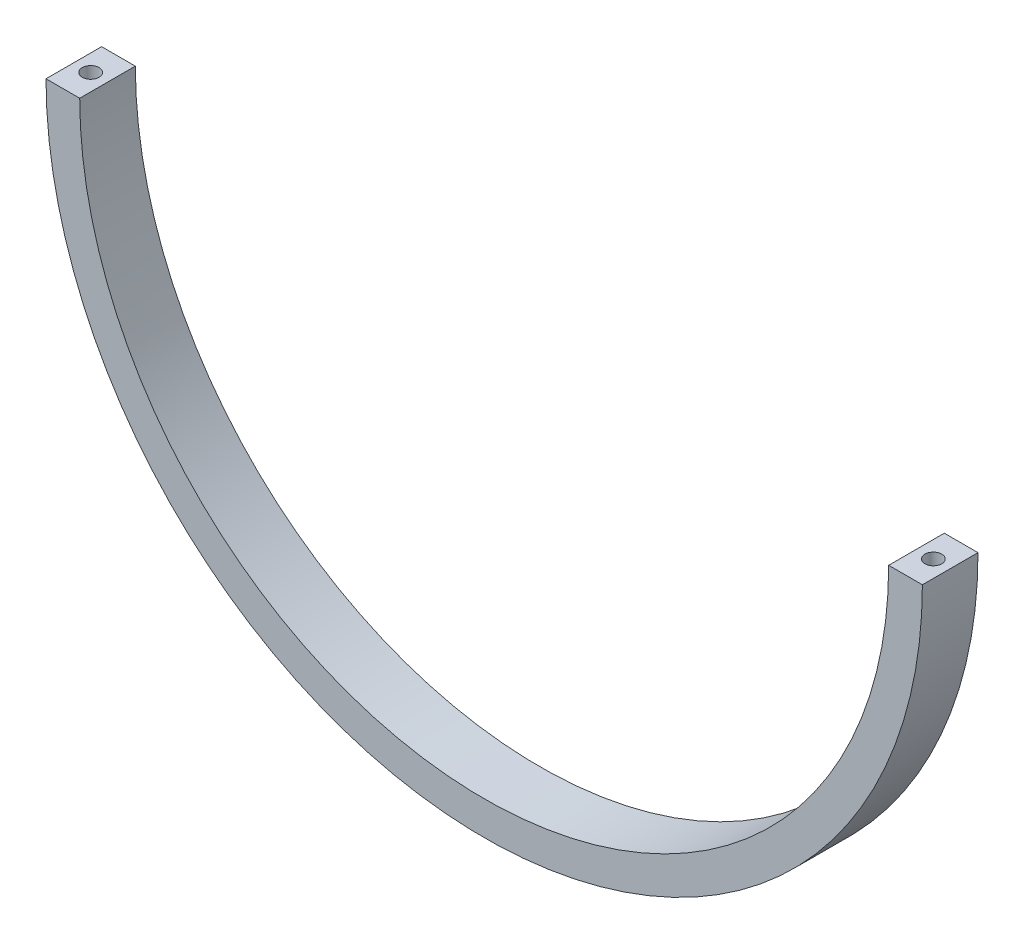
ISO-10303-21;
HEADER;
FILE_DESCRIPTION(('STEP AP214'),'2;1');
FILE_NAME('part.step','',(''),(''),'','','');
FILE_SCHEMA(('AUTOMOTIVE_DESIGN { 1 0 10303 214 1 1 1 1 }'));
ENDSEC;
DATA;
#1=APPLICATION_CONTEXT('core data for automotive mechanical design processes');
#2=APPLICATION_PROTOCOL_DEFINITION('international standard','automotive_design',2000,#1);
#3=PRODUCT_CONTEXT('',#1,'mechanical');
#4=PRODUCT('Part','Part','',(#3));
#5=PRODUCT_RELATED_PRODUCT_CATEGORY('part','',(#4));
#6=PRODUCT_DEFINITION_FORMATION('','',#4);
#7=PRODUCT_DEFINITION_CONTEXT('part definition',#1,'design');
#8=PRODUCT_DEFINITION('design','',#6,#7);
#9=PRODUCT_DEFINITION_SHAPE('','',#8);
#10=(LENGTH_UNIT() NAMED_UNIT(*) SI_UNIT(.MILLI.,.METRE.));
#11=(NAMED_UNIT(*) PLANE_ANGLE_UNIT() SI_UNIT($,.RADIAN.));
#12=(NAMED_UNIT(*) SI_UNIT($,.STERADIAN.) SOLID_ANGLE_UNIT());
#13=UNCERTAINTY_MEASURE_WITH_UNIT(LENGTH_MEASURE(1.E-05),#10,'distance_accuracy_value','');
#14=(GEOMETRIC_REPRESENTATION_CONTEXT(3) GLOBAL_UNCERTAINTY_ASSIGNED_CONTEXT((#13)) GLOBAL_UNIT_ASSIGNED_CONTEXT((#10,
#11,#12)) REPRESENTATION_CONTEXT('',''));
#15=CARTESIAN_POINT('',(0.,0.,0.));
#16=DIRECTION('',(0.,0.,1.));
#17=DIRECTION('',(1.,0.,0.));
#18=AXIS2_PLACEMENT_3D('',#15,#16,#17);
#19=CARTESIAN_POINT('',(0.,30.5190677017048,6.4339275));
#20=DIRECTION('',(0.,0.,-1.));
#21=DIRECTION('',(-1.,0.,0.));
#22=AXIS2_PLACEMENT_3D('',#19,#20,#21);
#23=CYLINDRICAL_SURFACE('',#22,69.5844);
#24=CARTESIAN_POINT('',(0.,30.5190677017048,-3.1339275));
#25=DIRECTION('',(0.,0.,-1.));
#26=DIRECTION('',(1.,0.,0.));
#27=AXIS2_PLACEMENT_3D('',#24,#25,#26);
#28=CIRCLE('',#27,69.5844);
#29=CARTESIAN_POINT('',(69.5844000000001,30.5190677017048,-3.1339275));
#30=VERTEX_POINT('',#29);
#31=CARTESIAN_POINT('',(-69.5844,30.5190677017048,-3.1339275));
#32=VERTEX_POINT('',#31);
#33=EDGE_CURVE('E97',#30,#32,#28,.T.);
#34=ORIENTED_EDGE('',*,*,#33,.T.);
#35=DIRECTION('',(0.,0.,-1.));
#36=VECTOR('',#35,1.);
#37=CARTESIAN_POINT('',(-69.5844,30.5190677017048,6.4339275));
#38=LINE('',#37,#36);
#39=CARTESIAN_POINT('',(-69.5844,30.5190677017048,6.4339275));
#40=VERTEX_POINT('',#39);
#41=EDGE_CURVE('E11',#40,#32,#38,.T.);
#42=ORIENTED_EDGE('',*,*,#41,.F.);
#43=CARTESIAN_POINT('',(0.,30.5190677017048,6.4339275));
#44=DIRECTION('',(0.,0.,-1.));
#45=DIRECTION('',(1.,0.,0.));
#46=AXIS2_PLACEMENT_3D('',#43,#44,#45);
#47=CIRCLE('',#46,69.5844);
#48=CARTESIAN_POINT('',(69.5844000000001,30.5190677017048,6.4339275));
#49=VERTEX_POINT('',#48);
#50=EDGE_CURVE('E85',#49,#40,#47,.T.);
#51=ORIENTED_EDGE('',*,*,#50,.F.);
#52=DIRECTION('',(0.,0.,-1.));
#53=VECTOR('',#52,1.);
#54=CARTESIAN_POINT('',(69.5844000000001,30.5190677017048,6.4339275));
#55=LINE('',#54,#53);
#56=EDGE_CURVE('E93',#49,#30,#55,.T.);
#57=ORIENTED_EDGE('',*,*,#56,.T.);
#58=EDGE_LOOP('',(#34,#42,#51,#57));
#59=FACE_BOUND('',#58,.T.);
#60=ADVANCED_FACE('F34',(#59),#23,.F.);
#61=CARTESIAN_POINT('',(-75.3831,30.5190677017048,6.4339275));
#62=DIRECTION('',(0.,-1.,0.));
#63=DIRECTION('',(0.,0.,-1.));
#64=AXIS2_PLACEMENT_3D('',#61,#62,#63);
#65=PLANE('',#64);
#66=CARTESIAN_POINT('',(-72.48375,30.5190677017048,1.65));
#67=DIRECTION('',(0.,1.,0.));
#68=DIRECTION('',(0.,0.,1.));
#69=AXIS2_PLACEMENT_3D('',#66,#67,#68);
#70=CIRCLE('',#69,1.449675);
#71=CARTESIAN_POINT('',(-72.48375,30.5190677017048,3.099675));
#72=VERTEX_POINT('',#71);
#73=EDGE_CURVE('E111',#72,#72,#70,.T.);
#74=ORIENTED_EDGE('',*,*,#73,.F.);
#75=EDGE_LOOP('',(#74));
#76=FACE_BOUND('',#75,.T.);
#77=DIRECTION('',(-1.,0.,0.));
#78=VECTOR('',#77,1.);
#79=CARTESIAN_POINT('',(-75.3831,30.5190677017048,-3.1339275));
#80=LINE('',#79,#78);
#81=CARTESIAN_POINT('',(-75.3831,30.5190677017048,-3.1339275));
#82=VERTEX_POINT('',#81);
#83=EDGE_CURVE('E89',#32,#82,#80,.T.);
#84=ORIENTED_EDGE('',*,*,#83,.T.);
#85=DIRECTION('',(0.,0.,-1.));
#86=VECTOR('',#85,1.);
#87=CARTESIAN_POINT('',(-75.3831,30.5190677017048,6.4339275));
#88=LINE('',#87,#86);
#89=CARTESIAN_POINT('',(-75.3831,30.5190677017048,6.4339275));
#90=VERTEX_POINT('',#89);
#91=EDGE_CURVE('E42',#90,#82,#88,.T.);
#92=ORIENTED_EDGE('',*,*,#91,.F.);
#93=DIRECTION('',(-1.,0.,0.));
#94=VECTOR('',#93,1.);
#95=CARTESIAN_POINT('',(-75.3831,30.5190677017048,6.4339275));
#96=LINE('',#95,#94);
#97=EDGE_CURVE('E80',#40,#90,#96,.T.);
#98=ORIENTED_EDGE('',*,*,#97,.F.);
#99=ORIENTED_EDGE('',*,*,#41,.T.);
#100=EDGE_LOOP('',(#84,#92,#98,#99));
#101=FACE_BOUND('',#100,.T.);
#102=ADVANCED_FACE('F88',(#76,#101),#65,.F.);
#103=CARTESIAN_POINT('',(0.,30.5190677017048,6.4339275));
#104=DIRECTION('',(0.,0.,-1.));
#105=DIRECTION('',(-1.,0.,0.));
#106=AXIS2_PLACEMENT_3D('',#103,#104,#105);
#107=CYLINDRICAL_SURFACE('',#106,75.3831);
#108=CARTESIAN_POINT('',(0.,30.5190677017048,-3.1339275));
#109=DIRECTION('',(0.,0.,1.));
#110=DIRECTION('',(1.,0.,0.));
#111=AXIS2_PLACEMENT_3D('',#108,#109,#110);
#112=CIRCLE('',#111,75.3831);
#113=CARTESIAN_POINT('',(75.3831000000001,30.5190677017048,-3.1339275));
#114=VERTEX_POINT('',#113);
#115=EDGE_CURVE('E67',#82,#114,#112,.T.);
#116=ORIENTED_EDGE('',*,*,#115,.T.);
#117=DIRECTION('',(0.,0.,-1.));
#118=VECTOR('',#117,1.);
#119=CARTESIAN_POINT('',(75.3831000000001,30.5190677017048,6.4339275));
#120=LINE('',#119,#118);
#121=CARTESIAN_POINT('',(75.3831000000001,30.5190677017048,6.4339275));
#122=VERTEX_POINT('',#121);
#123=EDGE_CURVE('E90',#122,#114,#120,.T.);
#124=ORIENTED_EDGE('',*,*,#123,.F.);
#125=CARTESIAN_POINT('',(0.,30.5190677017048,6.4339275));
#126=DIRECTION('',(0.,0.,1.));
#127=DIRECTION('',(1.,0.,0.));
#128=AXIS2_PLACEMENT_3D('',#125,#126,#127);
#129=CIRCLE('',#128,75.3831);
#130=EDGE_CURVE('E83',#90,#122,#129,.T.);
#131=ORIENTED_EDGE('',*,*,#130,.F.);
#132=ORIENTED_EDGE('',*,*,#91,.T.);
#133=EDGE_LOOP('',(#116,#124,#131,#132));
#134=FACE_BOUND('',#133,.T.);
#135=ADVANCED_FACE('F91',(#134),#107,.T.);
#136=CARTESIAN_POINT('',(69.5844000000001,30.5190677017048,6.4339275));
#137=DIRECTION('',(0.,-1.,0.));
#138=DIRECTION('',(0.,0.,-1.));
#139=AXIS2_PLACEMENT_3D('',#136,#137,#138);
#140=PLANE('',#139);
#141=CARTESIAN_POINT('',(72.4837500000001,30.5190677017048,1.65));
#142=DIRECTION('',(0.,1.,0.));
#143=DIRECTION('',(0.,0.,1.));
#144=AXIS2_PLACEMENT_3D('',#141,#142,#143);
#145=CIRCLE('',#144,1.449675);
#146=CARTESIAN_POINT('',(72.4837500000001,30.5190677017048,3.099675));
#147=VERTEX_POINT('',#146);
#148=EDGE_CURVE('E117',#147,#147,#145,.T.);
#149=ORIENTED_EDGE('',*,*,#148,.F.);
#150=EDGE_LOOP('',(#149));
#151=FACE_BOUND('',#150,.T.);
#152=DIRECTION('',(-1.,0.,0.));
#153=VECTOR('',#152,1.);
#154=CARTESIAN_POINT('',(69.5844000000001,30.5190677017048,-3.1339275));
#155=LINE('',#154,#153);
#156=EDGE_CURVE('E73',#114,#30,#155,.T.);
#157=ORIENTED_EDGE('',*,*,#156,.T.);
#158=ORIENTED_EDGE('',*,*,#56,.F.);
#159=DIRECTION('',(-1.,0.,0.));
#160=VECTOR('',#159,1.);
#161=CARTESIAN_POINT('',(69.5844000000001,30.5190677017048,6.4339275));
#162=LINE('',#161,#160);
#163=EDGE_CURVE('E50',#122,#49,#162,.T.);
#164=ORIENTED_EDGE('',*,*,#163,.F.);
#165=ORIENTED_EDGE('',*,*,#123,.T.);
#166=EDGE_LOOP('',(#157,#158,#164,#165));
#167=FACE_BOUND('',#166,.T.);
#168=ADVANCED_FACE('F105',(#151,#167),#140,.F.);
#169=CARTESIAN_POINT('',(0.,30.5190677017048,6.4339275));
#170=DIRECTION('',(0.,0.,1.));
#171=DIRECTION('',(1.,0.,0.));
#172=AXIS2_PLACEMENT_3D('',#169,#170,#171);
#173=PLANE('',#172);
#174=ORIENTED_EDGE('',*,*,#50,.T.);
#175=ORIENTED_EDGE('',*,*,#97,.T.);
#176=ORIENTED_EDGE('',*,*,#130,.T.);
#177=ORIENTED_EDGE('',*,*,#163,.T.);
#178=EDGE_LOOP('',(#174,#175,#176,#177));
#179=FACE_BOUND('',#178,.T.);
#180=ADVANCED_FACE('F81',(#179),#173,.T.);
#181=CARTESIAN_POINT('',(0.,30.5190677017048,-3.1339275));
#182=DIRECTION('',(0.,0.,1.));
#183=DIRECTION('',(1.,0.,0.));
#184=AXIS2_PLACEMENT_3D('',#181,#182,#183);
#185=PLANE('',#184);
#186=ORIENTED_EDGE('',*,*,#33,.F.);
#187=ORIENTED_EDGE('',*,*,#156,.F.);
#188=ORIENTED_EDGE('',*,*,#115,.F.);
#189=ORIENTED_EDGE('',*,*,#83,.F.);
#190=EDGE_LOOP('',(#186,#187,#188,#189));
#191=FACE_BOUND('',#190,.T.);
#192=ADVANCED_FACE('F108',(#191),#185,.F.);
#193=CARTESIAN_POINT('',(72.4837500000001,20.9512127017048,1.65));
#194=DIRECTION('',(0.,1.,0.));
#195=DIRECTION('',(0.,0.,1.));
#196=AXIS2_PLACEMENT_3D('',#193,#194,#195);
#197=CYLINDRICAL_SURFACE('',#196,1.449675);
#198=CARTESIAN_POINT('',(72.4837500000001,20.9512127017048,1.65));
#199=DIRECTION('',(0.,1.,0.));
#200=DIRECTION('',(0.,0.,1.));
#201=AXIS2_PLACEMENT_3D('',#198,#199,#200);
#202=CIRCLE('',#201,1.449675);
#203=CARTESIAN_POINT('',(72.4837500000001,20.9512127017048,3.099675));
#204=VERTEX_POINT('',#203);
#205=EDGE_CURVE('E100',#204,#204,#202,.T.);
#206=ORIENTED_EDGE('',*,*,#205,.F.);
#207=EDGE_LOOP('',(#206));
#208=FACE_BOUND('',#207,.T.);
#209=ORIENTED_EDGE('',*,*,#148,.T.);
#210=EDGE_LOOP('',(#209));
#211=FACE_BOUND('',#210,.T.);
#212=ADVANCED_FACE('F125',(#208,#211),#197,.F.);
#213=CARTESIAN_POINT('',(0.,20.9512127017048,-3.1339275));
#214=DIRECTION('',(0.,1.,0.));
#215=DIRECTION('',(0.,0.,1.));
#216=AXIS2_PLACEMENT_3D('',#213,#214,#215);
#217=PLANE('',#216);
#218=ORIENTED_EDGE('',*,*,#205,.T.);
#219=EDGE_LOOP('',(#218));
#220=FACE_BOUND('',#219,.T.);
#221=ADVANCED_FACE('F123',(#220),#217,.T.);
#222=CARTESIAN_POINT('',(-72.48375,20.9512127017048,1.65));
#223=DIRECTION('',(0.,1.,0.));
#224=DIRECTION('',(0.,0.,1.));
#225=AXIS2_PLACEMENT_3D('',#222,#223,#224);
#226=CYLINDRICAL_SURFACE('',#225,1.449675);
#227=CARTESIAN_POINT('',(-72.48375,20.9512127017048,1.65));
#228=DIRECTION('',(0.,1.,0.));
#229=DIRECTION('',(0.,0.,1.));
#230=AXIS2_PLACEMENT_3D('',#227,#228,#229);
#231=CIRCLE('',#230,1.449675);
#232=CARTESIAN_POINT('',(-72.48375,20.9512127017048,3.099675));
#233=VERTEX_POINT('',#232);
#234=EDGE_CURVE('E114',#233,#233,#231,.T.);
#235=ORIENTED_EDGE('',*,*,#234,.F.);
#236=EDGE_LOOP('',(#235));
#237=FACE_BOUND('',#236,.T.);
#238=ORIENTED_EDGE('',*,*,#73,.T.);
#239=EDGE_LOOP('',(#238));
#240=FACE_BOUND('',#239,.T.);
#241=ADVANCED_FACE('F149',(#237,#240),#226,.F.);
#242=CARTESIAN_POINT('',(0.,20.9512127017048,-3.1339275));
#243=DIRECTION('',(0.,1.,0.));
#244=DIRECTION('',(0.,0.,1.));
#245=AXIS2_PLACEMENT_3D('',#242,#243,#244);
#246=PLANE('',#245);
#247=ORIENTED_EDGE('',*,*,#234,.T.);
#248=EDGE_LOOP('',(#247));
#249=FACE_BOUND('',#248,.T.);
#250=ADVANCED_FACE('F151',(#249),#246,.T.);
#251=CLOSED_SHELL('',(#60,#102,#135,#168,#180,#192,#212,#221,#241,#250));
#252=MANIFOLD_SOLID_BREP('B2',#251);
#253=ADVANCED_BREP_SHAPE_REPRESENTATION('',(#18,#252),#14);
#254=SHAPE_DEFINITION_REPRESENTATION(#9,#253);
ENDSEC;
END-ISO-10303-21;
